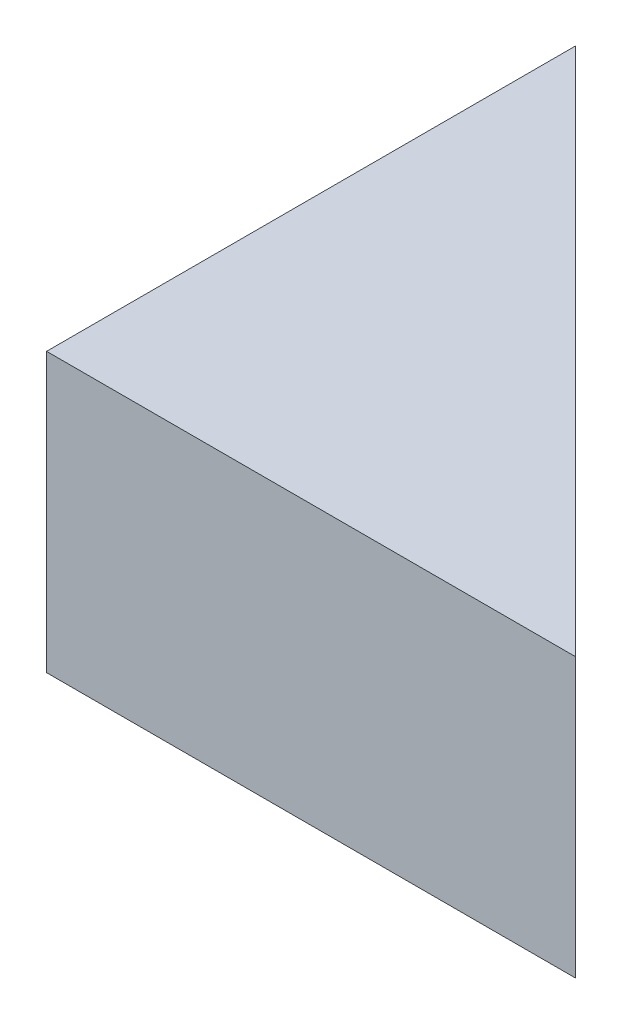
ISO-10303-21;
HEADER;
FILE_DESCRIPTION(('STEP AP214'),'2;1');
FILE_NAME('part.step','',(''),(''),'','','');
FILE_SCHEMA(('AUTOMOTIVE_DESIGN { 1 0 10303 214 1 1 1 1 }'));
ENDSEC;
DATA;
#1=APPLICATION_CONTEXT('core data for automotive mechanical design processes');
#2=APPLICATION_PROTOCOL_DEFINITION('international standard','automotive_design',2000,#1);
#3=PRODUCT_CONTEXT('',#1,'mechanical');
#4=PRODUCT('Part','Part','',(#3));
#5=PRODUCT_RELATED_PRODUCT_CATEGORY('part','',(#4));
#6=PRODUCT_DEFINITION_FORMATION('','',#4);
#7=PRODUCT_DEFINITION_CONTEXT('part definition',#1,'design');
#8=PRODUCT_DEFINITION('design','',#6,#7);
#9=PRODUCT_DEFINITION_SHAPE('','',#8);
#10=(LENGTH_UNIT() NAMED_UNIT(*) SI_UNIT(.MILLI.,.METRE.));
#11=(NAMED_UNIT(*) PLANE_ANGLE_UNIT() SI_UNIT($,.RADIAN.));
#12=(NAMED_UNIT(*) SI_UNIT($,.STERADIAN.) SOLID_ANGLE_UNIT());
#13=UNCERTAINTY_MEASURE_WITH_UNIT(LENGTH_MEASURE(1.E-05),#10,'distance_accuracy_value','');
#14=(GEOMETRIC_REPRESENTATION_CONTEXT(3) GLOBAL_UNCERTAINTY_ASSIGNED_CONTEXT((#13)) GLOBAL_UNIT_ASSIGNED_CONTEXT((#10,
#11,#12)) REPRESENTATION_CONTEXT('',''));
#15=CARTESIAN_POINT('',(0.,0.,0.));
#16=DIRECTION('',(0.,0.,1.));
#17=DIRECTION('',(1.,0.,0.));
#18=AXIS2_PLACEMENT_3D('',#15,#16,#17);
#19=CARTESIAN_POINT('',(-19.,20.,19.));
#20=DIRECTION('',(1.,0.,0.));
#21=DIRECTION('',(0.,0.,-1.));
#22=AXIS2_PLACEMENT_3D('',#19,#20,#21);
#23=PLANE('',#22);
#24=DIRECTION('',(0.,0.,1.));
#25=VECTOR('',#24,1.);
#26=CARTESIAN_POINT('',(-19.,0.,19.));
#27=LINE('',#26,#25);
#28=CARTESIAN_POINT('',(-19.,0.,-19.));
#29=VERTEX_POINT('',#28);
#30=CARTESIAN_POINT('',(-19.,0.,19.));
#31=VERTEX_POINT('',#30);
#32=EDGE_CURVE('E90',#29,#31,#27,.T.);
#33=ORIENTED_EDGE('',*,*,#32,.T.);
#34=DIRECTION('',(0.,-1.,0.));
#35=VECTOR('',#34,1.);
#36=CARTESIAN_POINT('',(-19.,20.,19.));
#37=LINE('',#36,#35);
#38=CARTESIAN_POINT('',(-19.,20.,19.));
#39=VERTEX_POINT('',#38);
#40=EDGE_CURVE('E11',#39,#31,#37,.T.);
#41=ORIENTED_EDGE('',*,*,#40,.F.);
#42=DIRECTION('',(0.,0.,1.));
#43=VECTOR('',#42,1.);
#44=CARTESIAN_POINT('',(-19.,20.,19.));
#45=LINE('',#44,#43);
#46=CARTESIAN_POINT('',(-19.,20.,-19.));
#47=VERTEX_POINT('',#46);
#48=EDGE_CURVE('E83',#47,#39,#45,.T.);
#49=ORIENTED_EDGE('',*,*,#48,.F.);
#50=DIRECTION('',(0.,-1.,0.));
#51=VECTOR('',#50,1.);
#52=CARTESIAN_POINT('',(-19.,20.,-19.));
#53=LINE('',#52,#51);
#54=EDGE_CURVE('E71',#47,#29,#53,.T.);
#55=ORIENTED_EDGE('',*,*,#54,.T.);
#56=EDGE_LOOP('',(#33,#41,#49,#55));
#57=FACE_BOUND('',#56,.T.);
#58=ADVANCED_FACE('F40',(#57),#23,.F.);
#59=CARTESIAN_POINT('',(19.,20.,19.));
#60=DIRECTION('',(0.,0.,-1.));
#61=DIRECTION('',(-1.,0.,0.));
#62=AXIS2_PLACEMENT_3D('',#59,#60,#61);
#63=PLANE('',#62);
#64=DIRECTION('',(1.,0.,0.));
#65=VECTOR('',#64,1.);
#66=CARTESIAN_POINT('',(19.,0.,19.));
#67=LINE('',#66,#65);
#68=CARTESIAN_POINT('',(19.,0.,19.));
#69=VERTEX_POINT('',#68);
#70=EDGE_CURVE('E63',#31,#69,#67,.T.);
#71=ORIENTED_EDGE('',*,*,#70,.T.);
#72=DIRECTION('',(0.,-1.,0.));
#73=VECTOR('',#72,1.);
#74=CARTESIAN_POINT('',(19.,20.,19.));
#75=LINE('',#74,#73);
#76=CARTESIAN_POINT('',(19.,20.,19.));
#77=VERTEX_POINT('',#76);
#78=EDGE_CURVE('E44',#77,#69,#75,.T.);
#79=ORIENTED_EDGE('',*,*,#78,.F.);
#80=DIRECTION('',(1.,0.,0.));
#81=VECTOR('',#80,1.);
#82=CARTESIAN_POINT('',(19.,20.,19.));
#83=LINE('',#82,#81);
#84=EDGE_CURVE('E51',#39,#77,#83,.T.);
#85=ORIENTED_EDGE('',*,*,#84,.F.);
#86=ORIENTED_EDGE('',*,*,#40,.T.);
#87=EDGE_LOOP('',(#71,#79,#85,#86));
#88=FACE_BOUND('',#87,.T.);
#89=ADVANCED_FACE('F94',(#88),#63,.F.);
#90=CARTESIAN_POINT('',(0.,20.,0.));
#91=DIRECTION('',(0.,1.,0.));
#92=DIRECTION('',(0.,0.,1.));
#93=AXIS2_PLACEMENT_3D('',#90,#91,#92);
#94=PLANE('',#93);
#95=DIRECTION('',(0.707106781186548,0.,0.707106781186548));
#96=VECTOR('',#95,1.);
#97=CARTESIAN_POINT('',(-19.,20.,-19.));
#98=LINE('',#97,#96);
#99=EDGE_CURVE('E76',#47,#77,#98,.T.);
#100=ORIENTED_EDGE('',*,*,#99,.F.);
#101=ORIENTED_EDGE('',*,*,#48,.T.);
#102=ORIENTED_EDGE('',*,*,#84,.T.);
#103=EDGE_LOOP('',(#100,#101,#102));
#104=FACE_BOUND('',#103,.T.);
#105=ADVANCED_FACE('F85',(#104),#94,.T.);
#106=CARTESIAN_POINT('',(0.,0.,0.));
#107=DIRECTION('',(0.,1.,0.));
#108=DIRECTION('',(0.,0.,1.));
#109=AXIS2_PLACEMENT_3D('',#106,#107,#108);
#110=PLANE('',#109);
#111=CARTESIAN_POINT('',(0.,0.,12.5));
#112=DIRECTION('',(0.,-1.,0.));
#113=DIRECTION('',(0.,0.,-1.));
#114=AXIS2_PLACEMENT_3D('',#111,#112,#113);
#115=CIRCLE('',#114,2.25);
#116=CARTESIAN_POINT('',(0.,0.,10.25));
#117=VERTEX_POINT('',#116);
#118=EDGE_CURVE('E126',#117,#117,#115,.T.);
#119=ORIENTED_EDGE('',*,*,#118,.F.);
#120=EDGE_LOOP('',(#119));
#121=FACE_BOUND('',#120,.T.);
#122=CARTESIAN_POINT('',(-12.5,0.,0.));
#123=DIRECTION('',(0.,-1.,0.));
#124=DIRECTION('',(0.,0.,-1.));
#125=AXIS2_PLACEMENT_3D('',#122,#123,#124);
#126=CIRCLE('',#125,2.25);
#127=CARTESIAN_POINT('',(-12.5,0.,-2.25));
#128=VERTEX_POINT('',#127);
#129=EDGE_CURVE('E130',#128,#128,#126,.T.);
#130=ORIENTED_EDGE('',*,*,#129,.F.);
#131=EDGE_LOOP('',(#130));
#132=FACE_BOUND('',#131,.T.);
#133=ORIENTED_EDGE('',*,*,#32,.F.);
#134=DIRECTION('',(0.707106781186548,0.,0.707106781186548));
#135=VECTOR('',#134,1.);
#136=CARTESIAN_POINT('',(-19.,0.,-19.));
#137=LINE('',#136,#135);
#138=EDGE_CURVE('E66',#29,#69,#137,.T.);
#139=ORIENTED_EDGE('',*,*,#138,.T.);
#140=ORIENTED_EDGE('',*,*,#70,.F.);
#141=EDGE_LOOP('',(#133,#139,#140));
#142=FACE_BOUND('',#141,.T.);
#143=ADVANCED_FACE('F91',(#121,#132,#142),#110,.F.);
#144=CARTESIAN_POINT('',(-19.,0.,-19.));
#145=DIRECTION('',(-0.707106781186548,0.,0.707106781186548));
#146=DIRECTION('',(0.707106781186548,0.,0.707106781186548));
#147=AXIS2_PLACEMENT_3D('',#144,#145,#146);
#148=PLANE('',#147);
#149=ORIENTED_EDGE('',*,*,#99,.T.);
#150=ORIENTED_EDGE('',*,*,#78,.T.);
#151=ORIENTED_EDGE('',*,*,#138,.F.);
#152=ORIENTED_EDGE('',*,*,#54,.F.);
#153=EDGE_LOOP('',(#149,#150,#151,#152));
#154=FACE_BOUND('',#153,.T.);
#155=ADVANCED_FACE('F73',(#154),#148,.F.);
#156=CARTESIAN_POINT('',(-12.5,5.,0.));
#157=DIRECTION('',(0.,-1.,0.));
#158=DIRECTION('',(0.,0.,-1.));
#159=AXIS2_PLACEMENT_3D('',#156,#157,#158);
#160=CYLINDRICAL_SURFACE('',#159,2.25);
#161=CARTESIAN_POINT('',(-12.5,5.,0.));
#162=DIRECTION('',(0.,-1.,0.));
#163=DIRECTION('',(0.,0.,-1.));
#164=AXIS2_PLACEMENT_3D('',#161,#162,#163);
#165=CIRCLE('',#164,2.25);
#166=CARTESIAN_POINT('',(-12.5,5.,-2.25));
#167=VERTEX_POINT('',#166);
#168=EDGE_CURVE('E84',#167,#167,#165,.T.);
#169=ORIENTED_EDGE('',*,*,#168,.F.);
#170=EDGE_LOOP('',(#169));
#171=FACE_BOUND('',#170,.T.);
#172=ORIENTED_EDGE('',*,*,#129,.T.);
#173=EDGE_LOOP('',(#172));
#174=FACE_BOUND('',#173,.T.);
#175=ADVANCED_FACE('F110',(#171,#174),#160,.F.);
#176=CARTESIAN_POINT('',(0.,5.,0.));
#177=DIRECTION('',(0.,-1.,0.));
#178=DIRECTION('',(0.,0.,-1.));
#179=AXIS2_PLACEMENT_3D('',#176,#177,#178);
#180=PLANE('',#179);
#181=ORIENTED_EDGE('',*,*,#168,.T.);
#182=EDGE_LOOP('',(#181));
#183=FACE_BOUND('',#182,.T.);
#184=ADVANCED_FACE('F109',(#183),#180,.T.);
#185=CARTESIAN_POINT('',(0.,5.,12.5));
#186=DIRECTION('',(0.,-1.,0.));
#187=DIRECTION('',(0.,0.,-1.));
#188=AXIS2_PLACEMENT_3D('',#185,#186,#187);
#189=CYLINDRICAL_SURFACE('',#188,2.25);
#190=CARTESIAN_POINT('',(0.,5.,12.5));
#191=DIRECTION('',(0.,-1.,0.));
#192=DIRECTION('',(0.,0.,-1.));
#193=AXIS2_PLACEMENT_3D('',#190,#191,#192);
#194=CIRCLE('',#193,2.25);
#195=CARTESIAN_POINT('',(0.,5.,10.25));
#196=VERTEX_POINT('',#195);
#197=EDGE_CURVE('E127',#196,#196,#194,.T.);
#198=ORIENTED_EDGE('',*,*,#197,.F.);
#199=EDGE_LOOP('',(#198));
#200=FACE_BOUND('',#199,.T.);
#201=ORIENTED_EDGE('',*,*,#118,.T.);
#202=EDGE_LOOP('',(#201));
#203=FACE_BOUND('',#202,.T.);
#204=ADVANCED_FACE('F111',(#200,#203),#189,.F.);
#205=CARTESIAN_POINT('',(0.,5.,0.));
#206=DIRECTION('',(0.,-1.,0.));
#207=DIRECTION('',(0.,0.,-1.));
#208=AXIS2_PLACEMENT_3D('',#205,#206,#207);
#209=PLANE('',#208);
#210=ORIENTED_EDGE('',*,*,#197,.T.);
#211=EDGE_LOOP('',(#210));
#212=FACE_BOUND('',#211,.T.);
#213=ADVANCED_FACE('F117',(#212),#209,.T.);
#214=CLOSED_SHELL('',(#58,#89,#105,#143,#155,#175,#184,#204,#213));
#215=MANIFOLD_SOLID_BREP('B2',#214);
#216=ADVANCED_BREP_SHAPE_REPRESENTATION('',(#18,#215),#14);
#217=SHAPE_DEFINITION_REPRESENTATION(#9,#216);
ENDSEC;
END-ISO-10303-21;
